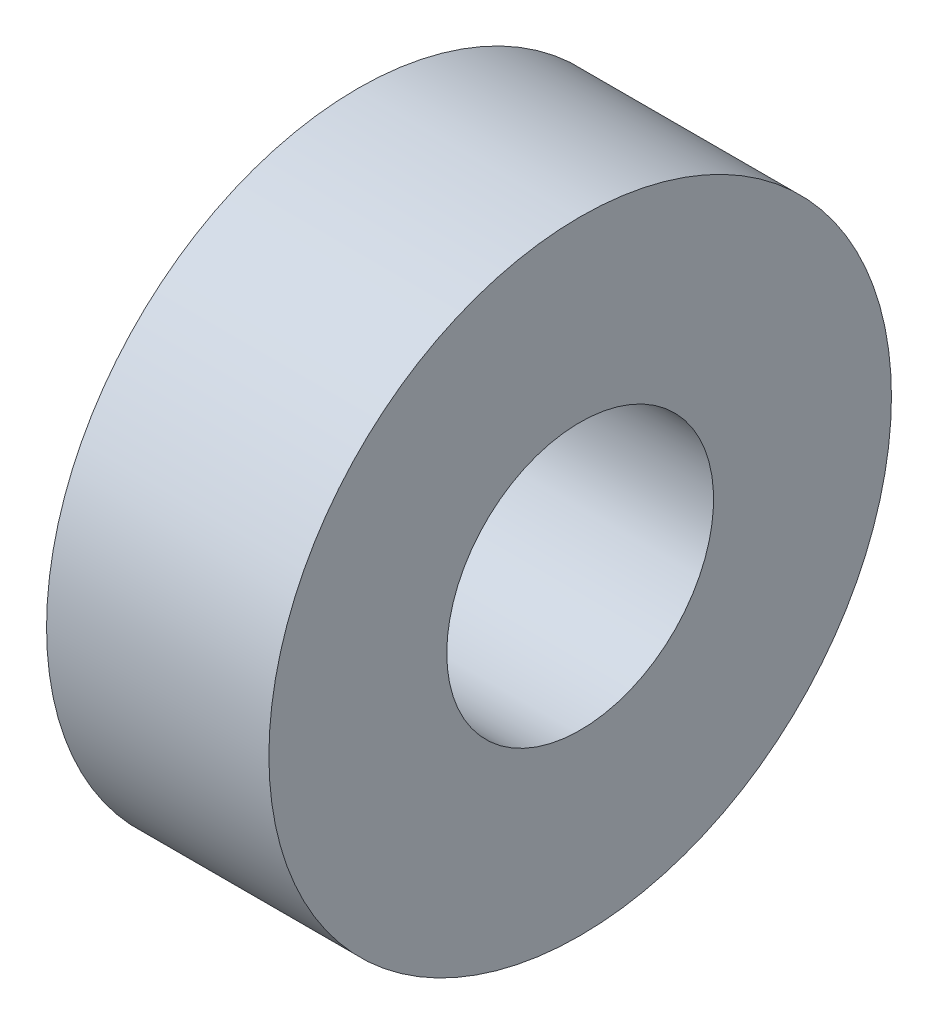
ISO-10303-21;
HEADER;
FILE_DESCRIPTION(('STEP AP214'),'2;1');
FILE_NAME('part.step','',(''),(''),'','','');
FILE_SCHEMA(('AUTOMOTIVE_DESIGN { 1 0 10303 214 1 1 1 1 }'));
ENDSEC;
DATA;
#1=APPLICATION_CONTEXT('core data for automotive mechanical design processes');
#2=APPLICATION_PROTOCOL_DEFINITION('international standard','automotive_design',2000,#1);
#3=PRODUCT_CONTEXT('',#1,'mechanical');
#4=PRODUCT('Part','Part','',(#3));
#5=PRODUCT_RELATED_PRODUCT_CATEGORY('part','',(#4));
#6=PRODUCT_DEFINITION_FORMATION('','',#4);
#7=PRODUCT_DEFINITION_CONTEXT('part definition',#1,'design');
#8=PRODUCT_DEFINITION('design','',#6,#7);
#9=PRODUCT_DEFINITION_SHAPE('','',#8);
#10=(LENGTH_UNIT() NAMED_UNIT(*) SI_UNIT(.MILLI.,.METRE.));
#11=(NAMED_UNIT(*) PLANE_ANGLE_UNIT() SI_UNIT($,.RADIAN.));
#12=(NAMED_UNIT(*) SI_UNIT($,.STERADIAN.) SOLID_ANGLE_UNIT());
#13=UNCERTAINTY_MEASURE_WITH_UNIT(LENGTH_MEASURE(1.E-05),#10,'distance_accuracy_value','');
#14=(GEOMETRIC_REPRESENTATION_CONTEXT(3) GLOBAL_UNCERTAINTY_ASSIGNED_CONTEXT((#13)) GLOBAL_UNIT_ASSIGNED_CONTEXT((#10,
#11,#12)) REPRESENTATION_CONTEXT('',''));
#15=CARTESIAN_POINT('',(0.,0.,0.));
#16=DIRECTION('',(0.,0.,1.));
#17=DIRECTION('',(1.,0.,0.));
#18=AXIS2_PLACEMENT_3D('',#15,#16,#17);
#19=CARTESIAN_POINT('',(0.,7.,0.));
#20=DIRECTION('',(1.,0.,0.));
#21=DIRECTION('',(0.,0.,-1.));
#22=AXIS2_PLACEMENT_3D('',#19,#20,#21);
#23=PLANE('',#22);
#24=CARTESIAN_POINT('',(0.,0.,0.));
#25=DIRECTION('',(-1.,0.,0.));
#26=DIRECTION('',(0.,0.,1.));
#27=AXIS2_PLACEMENT_3D('',#24,#25,#26);
#28=CIRCLE('',#27,3.);
#29=CARTESIAN_POINT('',(0.,0.,3.));
#30=VERTEX_POINT('',#29);
#31=EDGE_CURVE('E10',#30,#30,#28,.T.);
#32=ORIENTED_EDGE('',*,*,#31,.F.);
#33=EDGE_LOOP('',(#32));
#34=FACE_BOUND('',#33,.T.);
#35=CARTESIAN_POINT('',(0.,0.,0.));
#36=DIRECTION('',(-1.,0.,0.));
#37=DIRECTION('',(0.,0.,1.));
#38=AXIS2_PLACEMENT_3D('',#35,#36,#37);
#39=CIRCLE('',#38,7.);
#40=CARTESIAN_POINT('',(0.,0.,7.));
#41=VERTEX_POINT('',#40);
#42=EDGE_CURVE('E60',#41,#41,#39,.T.);
#43=ORIENTED_EDGE('',*,*,#42,.T.);
#44=EDGE_LOOP('',(#43));
#45=FACE_BOUND('',#44,.T.);
#46=ADVANCED_FACE('F43',(#34,#45),#23,.F.);
#47=CARTESIAN_POINT('',(0.,0.,0.));
#48=DIRECTION('',(-1.,0.,0.));
#49=DIRECTION('',(0.,0.,1.));
#50=AXIS2_PLACEMENT_3D('',#47,#48,#49);
#51=CYLINDRICAL_SURFACE('',#50,3.);
#52=CARTESIAN_POINT('',(5.,0.,0.));
#53=DIRECTION('',(-1.,0.,0.));
#54=DIRECTION('',(0.,0.,1.));
#55=AXIS2_PLACEMENT_3D('',#52,#53,#54);
#56=CIRCLE('',#55,3.);
#57=CARTESIAN_POINT('',(5.,0.,3.));
#58=VERTEX_POINT('',#57);
#59=EDGE_CURVE('E50',#58,#58,#56,.T.);
#60=ORIENTED_EDGE('',*,*,#59,.F.);
#61=EDGE_LOOP('',(#60));
#62=FACE_BOUND('',#61,.T.);
#63=ORIENTED_EDGE('',*,*,#31,.T.);
#64=EDGE_LOOP('',(#63));
#65=FACE_BOUND('',#64,.T.);
#66=ADVANCED_FACE('F76',(#62,#65),#51,.F.);
#67=CARTESIAN_POINT('',(5.,3.,0.));
#68=DIRECTION('',(-1.,0.,0.));
#69=DIRECTION('',(0.,0.,1.));
#70=AXIS2_PLACEMENT_3D('',#67,#68,#69);
#71=PLANE('',#70);
#72=CARTESIAN_POINT('',(5.,0.,0.));
#73=DIRECTION('',(-1.,0.,0.));
#74=DIRECTION('',(0.,0.,1.));
#75=AXIS2_PLACEMENT_3D('',#72,#73,#74);
#76=CIRCLE('',#75,7.);
#77=CARTESIAN_POINT('',(5.,0.,7.));
#78=VERTEX_POINT('',#77);
#79=EDGE_CURVE('E55',#78,#78,#76,.T.);
#80=ORIENTED_EDGE('',*,*,#79,.F.);
#81=EDGE_LOOP('',(#80));
#82=FACE_BOUND('',#81,.T.);
#83=ORIENTED_EDGE('',*,*,#59,.T.);
#84=EDGE_LOOP('',(#83));
#85=FACE_BOUND('',#84,.T.);
#86=ADVANCED_FACE('F71',(#82,#85),#71,.F.);
#87=CARTESIAN_POINT('',(0.,0.,0.));
#88=DIRECTION('',(-1.,0.,0.));
#89=DIRECTION('',(0.,0.,1.));
#90=AXIS2_PLACEMENT_3D('',#87,#88,#89);
#91=CYLINDRICAL_SURFACE('',#90,7.);
#92=ORIENTED_EDGE('',*,*,#42,.F.);
#93=EDGE_LOOP('',(#92));
#94=FACE_BOUND('',#93,.T.);
#95=ORIENTED_EDGE('',*,*,#79,.T.);
#96=EDGE_LOOP('',(#95));
#97=FACE_BOUND('',#96,.T.);
#98=ADVANCED_FACE('F68',(#94,#97),#91,.T.);
#99=CLOSED_SHELL('',(#46,#66,#86,#98));
#100=MANIFOLD_SOLID_BREP('B2',#99);
#101=ADVANCED_BREP_SHAPE_REPRESENTATION('',(#18,#100),#14);
#102=SHAPE_DEFINITION_REPRESENTATION(#9,#101);
ENDSEC;
END-ISO-10303-21;
